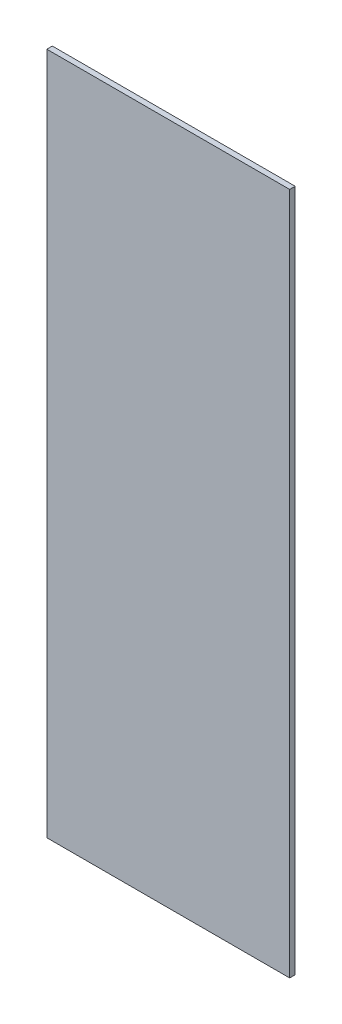
ISO-10303-21;
HEADER;
FILE_DESCRIPTION(('STEP AP214'),'2;1');
FILE_NAME('part.step','',(''),(''),'','','');
FILE_SCHEMA(('AUTOMOTIVE_DESIGN { 1 0 10303 214 1 1 1 1 }'));
ENDSEC;
DATA;
#1=APPLICATION_CONTEXT('core data for automotive mechanical design processes');
#2=APPLICATION_PROTOCOL_DEFINITION('international standard','automotive_design',2000,#1);
#3=PRODUCT_CONTEXT('',#1,'mechanical');
#4=PRODUCT('Part','Part','',(#3));
#5=PRODUCT_RELATED_PRODUCT_CATEGORY('part','',(#4));
#6=PRODUCT_DEFINITION_FORMATION('','',#4);
#7=PRODUCT_DEFINITION_CONTEXT('part definition',#1,'design');
#8=PRODUCT_DEFINITION('design','',#6,#7);
#9=PRODUCT_DEFINITION_SHAPE('','',#8);
#10=(LENGTH_UNIT() NAMED_UNIT(*) SI_UNIT(.MILLI.,.METRE.));
#11=(NAMED_UNIT(*) PLANE_ANGLE_UNIT() SI_UNIT($,.RADIAN.));
#12=(NAMED_UNIT(*) SI_UNIT($,.STERADIAN.) SOLID_ANGLE_UNIT());
#13=UNCERTAINTY_MEASURE_WITH_UNIT(LENGTH_MEASURE(1.E-05),#10,'distance_accuracy_value','');
#14=(GEOMETRIC_REPRESENTATION_CONTEXT(3) GLOBAL_UNCERTAINTY_ASSIGNED_CONTEXT((#13)) GLOBAL_UNIT_ASSIGNED_CONTEXT((#10,
#11,#12)) REPRESENTATION_CONTEXT('',''));
#15=CARTESIAN_POINT('',(0.,0.,0.));
#16=DIRECTION('',(0.,0.,1.));
#17=DIRECTION('',(1.,0.,0.));
#18=AXIS2_PLACEMENT_3D('',#15,#16,#17);
#19=CARTESIAN_POINT('',(-132.5,-372.5,6.));
#20=DIRECTION('',(1.,0.,0.));
#21=DIRECTION('',(0.,0.,-1.));
#22=AXIS2_PLACEMENT_3D('',#19,#20,#21);
#23=PLANE('',#22);
#24=DIRECTION('',(0.,-1.,0.));
#25=VECTOR('',#24,1.);
#26=CARTESIAN_POINT('',(-132.5,-372.5,0.));
#27=LINE('',#26,#25);
#28=CARTESIAN_POINT('',(-132.5,372.5,0.));
#29=VERTEX_POINT('',#28);
#30=CARTESIAN_POINT('',(-132.5,-372.5,0.));
#31=VERTEX_POINT('',#30);
#32=EDGE_CURVE('E96',#29,#31,#27,.T.);
#33=ORIENTED_EDGE('',*,*,#32,.T.);
#34=DIRECTION('',(0.,0.,-1.));
#35=VECTOR('',#34,1.);
#36=CARTESIAN_POINT('',(-132.5,-372.5,6.));
#37=LINE('',#36,#35);
#38=CARTESIAN_POINT('',(-132.5,-372.5,6.));
#39=VERTEX_POINT('',#38);
#40=EDGE_CURVE('E11',#39,#31,#37,.T.);
#41=ORIENTED_EDGE('',*,*,#40,.F.);
#42=DIRECTION('',(0.,-1.,0.));
#43=VECTOR('',#42,1.);
#44=CARTESIAN_POINT('',(-132.5,-372.5,6.));
#45=LINE('',#44,#43);
#46=CARTESIAN_POINT('',(-132.5,372.5,6.));
#47=VERTEX_POINT('',#46);
#48=EDGE_CURVE('E84',#47,#39,#45,.T.);
#49=ORIENTED_EDGE('',*,*,#48,.F.);
#50=DIRECTION('',(0.,0.,-1.));
#51=VECTOR('',#50,1.);
#52=CARTESIAN_POINT('',(-132.5,372.5,6.));
#53=LINE('',#52,#51);
#54=EDGE_CURVE('E92',#47,#29,#53,.T.);
#55=ORIENTED_EDGE('',*,*,#54,.T.);
#56=EDGE_LOOP('',(#33,#41,#49,#55));
#57=FACE_BOUND('',#56,.T.);
#58=ADVANCED_FACE('F33',(#57),#23,.F.);
#59=CARTESIAN_POINT('',(132.5,-372.5,6.));
#60=DIRECTION('',(0.,1.,0.));
#61=DIRECTION('',(0.,0.,1.));
#62=AXIS2_PLACEMENT_3D('',#59,#60,#61);
#63=PLANE('',#62);
#64=DIRECTION('',(1.,0.,0.));
#65=VECTOR('',#64,1.);
#66=CARTESIAN_POINT('',(132.5,-372.5,0.));
#67=LINE('',#66,#65);
#68=CARTESIAN_POINT('',(132.5,-372.5,0.));
#69=VERTEX_POINT('',#68);
#70=EDGE_CURVE('E88',#31,#69,#67,.T.);
#71=ORIENTED_EDGE('',*,*,#70,.T.);
#72=DIRECTION('',(0.,0.,-1.));
#73=VECTOR('',#72,1.);
#74=CARTESIAN_POINT('',(132.5,-372.5,6.));
#75=LINE('',#74,#73);
#76=CARTESIAN_POINT('',(132.5,-372.5,6.));
#77=VERTEX_POINT('',#76);
#78=EDGE_CURVE('E41',#77,#69,#75,.T.);
#79=ORIENTED_EDGE('',*,*,#78,.F.);
#80=DIRECTION('',(1.,0.,0.));
#81=VECTOR('',#80,1.);
#82=CARTESIAN_POINT('',(132.5,-372.5,6.));
#83=LINE('',#82,#81);
#84=EDGE_CURVE('E79',#39,#77,#83,.T.);
#85=ORIENTED_EDGE('',*,*,#84,.F.);
#86=ORIENTED_EDGE('',*,*,#40,.T.);
#87=EDGE_LOOP('',(#71,#79,#85,#86));
#88=FACE_BOUND('',#87,.T.);
#89=ADVANCED_FACE('F87',(#88),#63,.F.);
#90=CARTESIAN_POINT('',(132.5,-372.5,6.));
#91=DIRECTION('',(-1.,0.,0.));
#92=DIRECTION('',(0.,0.,1.));
#93=AXIS2_PLACEMENT_3D('',#90,#91,#92);
#94=PLANE('',#93);
#95=DIRECTION('',(0.,1.,0.));
#96=VECTOR('',#95,1.);
#97=CARTESIAN_POINT('',(132.5,-372.5,0.));
#98=LINE('',#97,#96);
#99=CARTESIAN_POINT('',(132.5,372.5,0.));
#100=VERTEX_POINT('',#99);
#101=EDGE_CURVE('E66',#69,#100,#98,.T.);
#102=ORIENTED_EDGE('',*,*,#101,.T.);
#103=DIRECTION('',(0.,0.,-1.));
#104=VECTOR('',#103,1.);
#105=CARTESIAN_POINT('',(132.5,372.5,6.));
#106=LINE('',#105,#104);
#107=CARTESIAN_POINT('',(132.5,372.5,6.));
#108=VERTEX_POINT('',#107);
#109=EDGE_CURVE('E89',#108,#100,#106,.T.);
#110=ORIENTED_EDGE('',*,*,#109,.F.);
#111=DIRECTION('',(0.,1.,0.));
#112=VECTOR('',#111,1.);
#113=CARTESIAN_POINT('',(132.5,-372.5,6.));
#114=LINE('',#113,#112);
#115=EDGE_CURVE('E82',#77,#108,#114,.T.);
#116=ORIENTED_EDGE('',*,*,#115,.F.);
#117=ORIENTED_EDGE('',*,*,#78,.T.);
#118=EDGE_LOOP('',(#102,#110,#116,#117));
#119=FACE_BOUND('',#118,.T.);
#120=ADVANCED_FACE('F90',(#119),#94,.F.);
#121=CARTESIAN_POINT('',(132.5,372.5,6.));
#122=DIRECTION('',(0.,-1.,0.));
#123=DIRECTION('',(1.,0.,0.));
#124=AXIS2_PLACEMENT_3D('',#121,#122,#123);
#125=PLANE('',#124);
#126=DIRECTION('',(-1.,0.,0.));
#127=VECTOR('',#126,1.);
#128=CARTESIAN_POINT('',(132.5,372.5,0.));
#129=LINE('',#128,#127);
#130=EDGE_CURVE('E72',#100,#29,#129,.T.);
#131=ORIENTED_EDGE('',*,*,#130,.T.);
#132=ORIENTED_EDGE('',*,*,#54,.F.);
#133=DIRECTION('',(-1.,0.,0.));
#134=VECTOR('',#133,1.);
#135=CARTESIAN_POINT('',(132.5,372.5,6.));
#136=LINE('',#135,#134);
#137=EDGE_CURVE('E49',#108,#47,#136,.T.);
#138=ORIENTED_EDGE('',*,*,#137,.F.);
#139=ORIENTED_EDGE('',*,*,#109,.T.);
#140=EDGE_LOOP('',(#131,#132,#138,#139));
#141=FACE_BOUND('',#140,.T.);
#142=ADVANCED_FACE('F103',(#141),#125,.F.);
#143=CARTESIAN_POINT('',(0.,0.,6.));
#144=DIRECTION('',(0.,0.,1.));
#145=DIRECTION('',(1.,0.,0.));
#146=AXIS2_PLACEMENT_3D('',#143,#144,#145);
#147=PLANE('',#146);
#148=ORIENTED_EDGE('',*,*,#48,.T.);
#149=ORIENTED_EDGE('',*,*,#84,.T.);
#150=ORIENTED_EDGE('',*,*,#115,.T.);
#151=ORIENTED_EDGE('',*,*,#137,.T.);
#152=EDGE_LOOP('',(#148,#149,#150,#151));
#153=FACE_BOUND('',#152,.T.);
#154=ADVANCED_FACE('F80',(#153),#147,.T.);
#155=CARTESIAN_POINT('',(0.,0.,0.));
#156=DIRECTION('',(0.,0.,1.));
#157=DIRECTION('',(1.,0.,0.));
#158=AXIS2_PLACEMENT_3D('',#155,#156,#157);
#159=PLANE('',#158);
#160=ORIENTED_EDGE('',*,*,#32,.F.);
#161=ORIENTED_EDGE('',*,*,#130,.F.);
#162=ORIENTED_EDGE('',*,*,#101,.F.);
#163=ORIENTED_EDGE('',*,*,#70,.F.);
#164=EDGE_LOOP('',(#160,#161,#162,#163));
#165=FACE_BOUND('',#164,.T.);
#166=ADVANCED_FACE('F106',(#165),#159,.F.);
#167=CLOSED_SHELL('',(#58,#89,#120,#142,#154,#166));
#168=MANIFOLD_SOLID_BREP('B2',#167);
#169=ADVANCED_BREP_SHAPE_REPRESENTATION('',(#18,#168),#14);
#170=SHAPE_DEFINITION_REPRESENTATION(#9,#169);
ENDSEC;
END-ISO-10303-21;
